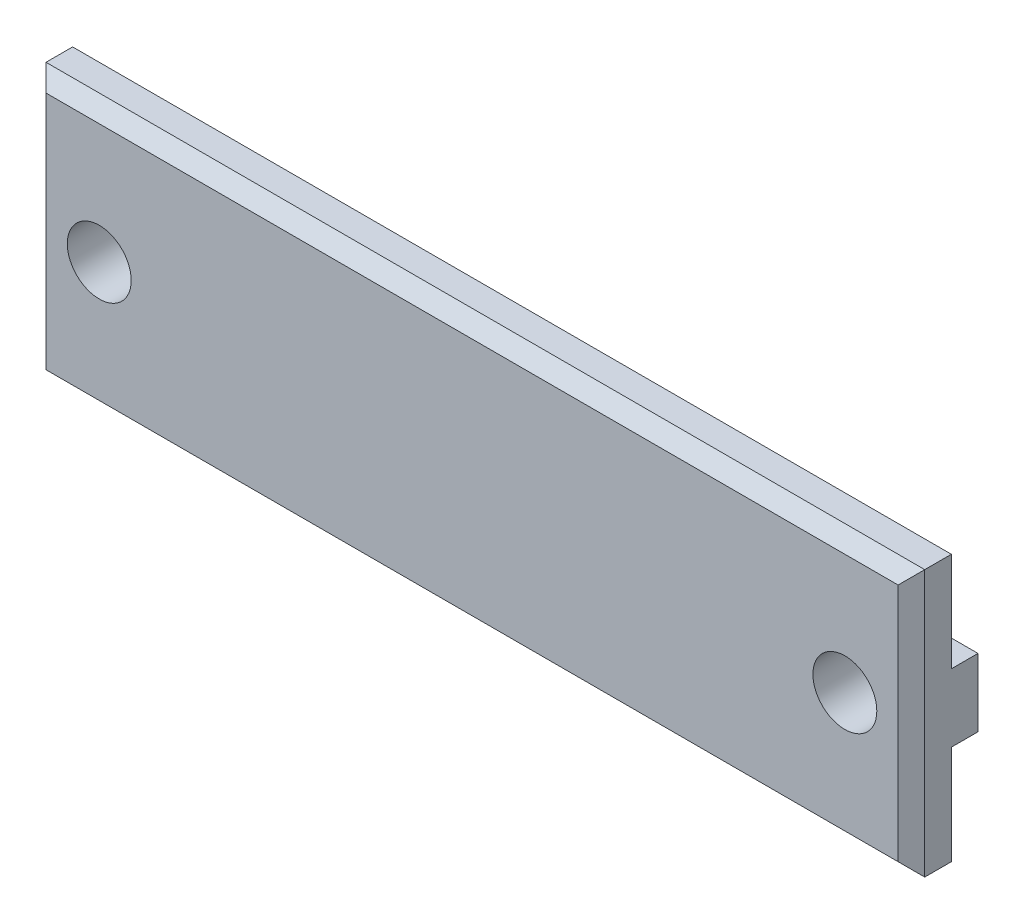
ISO-10303-21;
HEADER;
FILE_DESCRIPTION(('STEP AP214'),'2;1');
FILE_NAME('part.step','',(''),(''),'','','');
FILE_SCHEMA(('AUTOMOTIVE_DESIGN { 1 0 10303 214 1 1 1 1 }'));
ENDSEC;
DATA;
#1=APPLICATION_CONTEXT('core data for automotive mechanical design processes');
#2=APPLICATION_PROTOCOL_DEFINITION('international standard','automotive_design',2000,#1);
#3=PRODUCT_CONTEXT('',#1,'mechanical');
#4=PRODUCT('Part','Part','',(#3));
#5=PRODUCT_RELATED_PRODUCT_CATEGORY('part','',(#4));
#6=PRODUCT_DEFINITION_FORMATION('','',#4);
#7=PRODUCT_DEFINITION_CONTEXT('part definition',#1,'design');
#8=PRODUCT_DEFINITION('design','',#6,#7);
#9=PRODUCT_DEFINITION_SHAPE('','',#8);
#10=(LENGTH_UNIT() NAMED_UNIT(*) SI_UNIT(.MILLI.,.METRE.));
#11=(NAMED_UNIT(*) PLANE_ANGLE_UNIT() SI_UNIT($,.RADIAN.));
#12=(NAMED_UNIT(*) SI_UNIT($,.STERADIAN.) SOLID_ANGLE_UNIT());
#13=UNCERTAINTY_MEASURE_WITH_UNIT(LENGTH_MEASURE(1.E-05),#10,'distance_accuracy_value','');
#14=(GEOMETRIC_REPRESENTATION_CONTEXT(3) GLOBAL_UNCERTAINTY_ASSIGNED_CONTEXT((#13)) GLOBAL_UNIT_ASSIGNED_CONTEXT((#10,
#11,#12)) REPRESENTATION_CONTEXT('',''));
#15=CARTESIAN_POINT('',(0.,0.,0.));
#16=DIRECTION('',(0.,0.,1.));
#17=DIRECTION('',(1.,0.,0.));
#18=AXIS2_PLACEMENT_3D('',#15,#16,#17);
#19=CARTESIAN_POINT('',(0.,0.,2.));
#20=DIRECTION('',(0.,0.,1.));
#21=DIRECTION('',(1.,0.,0.));
#22=AXIS2_PLACEMENT_3D('',#19,#20,#21);
#23=PLANE('',#22);
#24=DIRECTION('',(-1.,0.,0.));
#25=VECTOR('',#24,1.);
#26=CARTESIAN_POINT('',(23.,2.55,2.));
#27=LINE('',#26,#25);
#28=CARTESIAN_POINT('',(33.,2.55,2.));
#29=VERTEX_POINT('',#28);
#30=CARTESIAN_POINT('',(23.,2.55,2.));
#31=VERTEX_POINT('',#30);
#32=EDGE_CURVE('E161',#29,#31,#27,.T.);
#33=ORIENTED_EDGE('',*,*,#32,.T.);
#34=DIRECTION('',(0.,-1.,0.));
#35=VECTOR('',#34,1.);
#36=CARTESIAN_POINT('',(23.,2.55,2.));
#37=LINE('',#36,#35);
#38=CARTESIAN_POINT('',(23.,-2.55,2.));
#39=VERTEX_POINT('',#38);
#40=EDGE_CURVE('E188',#31,#39,#37,.T.);
#41=ORIENTED_EDGE('',*,*,#40,.T.);
#42=DIRECTION('',(1.,0.,0.));
#43=VECTOR('',#42,1.);
#44=CARTESIAN_POINT('',(23.,-2.55,2.));
#45=LINE('',#44,#43);
#46=CARTESIAN_POINT('',(33.,-2.55,2.));
#47=VERTEX_POINT('',#46);
#48=EDGE_CURVE('E170',#39,#47,#45,.T.);
#49=ORIENTED_EDGE('',*,*,#48,.T.);
#50=DIRECTION('',(0.,1.,0.));
#51=VECTOR('',#50,1.);
#52=CARTESIAN_POINT('',(33.,10.,2.));
#53=LINE('',#52,#51);
#54=CARTESIAN_POINT('',(33.,-10.,2.));
#55=VERTEX_POINT('',#54);
#56=EDGE_CURVE('E168',#55,#47,#53,.T.);
#57=ORIENTED_EDGE('',*,*,#56,.F.);
#58=DIRECTION('',(1.,0.,0.));
#59=VECTOR('',#58,1.);
#60=CARTESIAN_POINT('',(-33.,-10.,2.));
#61=LINE('',#60,#59);
#62=CARTESIAN_POINT('',(-33.,-10.,2.));
#63=VERTEX_POINT('',#62);
#64=EDGE_CURVE('E197',#63,#55,#61,.T.);
#65=ORIENTED_EDGE('',*,*,#64,.F.);
#66=DIRECTION('',(0.,-1.,0.));
#67=VECTOR('',#66,1.);
#68=CARTESIAN_POINT('',(-33.,10.,2.));
#69=LINE('',#68,#67);
#70=CARTESIAN_POINT('',(-33.,-2.55,2.));
#71=VERTEX_POINT('',#70);
#72=EDGE_CURVE('E176',#71,#63,#69,.T.);
#73=ORIENTED_EDGE('',*,*,#72,.F.);
#74=DIRECTION('',(1.,0.,0.));
#75=VECTOR('',#74,1.);
#76=CARTESIAN_POINT('',(-33.,-2.55,2.));
#77=LINE('',#76,#75);
#78=CARTESIAN_POINT('',(-23.,-2.55,2.));
#79=VERTEX_POINT('',#78);
#80=EDGE_CURVE('E230',#71,#79,#77,.T.);
#81=ORIENTED_EDGE('',*,*,#80,.T.);
#82=DIRECTION('',(0.,1.,0.));
#83=VECTOR('',#82,1.);
#84=CARTESIAN_POINT('',(-23.,2.55,2.));
#85=LINE('',#84,#83);
#86=CARTESIAN_POINT('',(-23.,2.55,2.));
#87=VERTEX_POINT('',#86);
#88=EDGE_CURVE('E221',#79,#87,#85,.T.);
#89=ORIENTED_EDGE('',*,*,#88,.T.);
#90=DIRECTION('',(-1.,0.,0.));
#91=VECTOR('',#90,1.);
#92=CARTESIAN_POINT('',(-33.,2.55,2.));
#93=LINE('',#92,#91);
#94=CARTESIAN_POINT('',(-33.,2.55,2.));
#95=VERTEX_POINT('',#94);
#96=EDGE_CURVE('E225',#87,#95,#93,.T.);
#97=ORIENTED_EDGE('',*,*,#96,.T.);
#98=CARTESIAN_POINT('',(-33.,10.,2.));
#99=VERTEX_POINT('',#98);
#100=EDGE_CURVE('E181',#99,#95,#69,.T.);
#101=ORIENTED_EDGE('',*,*,#100,.F.);
#102=DIRECTION('',(-1.,0.,0.));
#103=VECTOR('',#102,1.);
#104=CARTESIAN_POINT('',(-33.,10.,2.));
#105=LINE('',#104,#103);
#106=CARTESIAN_POINT('',(33.,10.,2.));
#107=VERTEX_POINT('',#106);
#108=EDGE_CURVE('E204',#107,#99,#105,.T.);
#109=ORIENTED_EDGE('',*,*,#108,.F.);
#110=EDGE_CURVE('E201',#29,#107,#53,.T.);
#111=ORIENTED_EDGE('',*,*,#110,.F.);
#112=EDGE_LOOP('',(#33,#41,#49,#57,#65,#73,#81,#89,#97,#101,#109,#111));
#113=FACE_BOUND('',#112,.T.);
#114=ADVANCED_FACE('F45',(#113),#23,.F.);
#115=CARTESIAN_POINT('',(-23.,2.55,2.));
#116=DIRECTION('',(-1.,0.,0.));
#117=DIRECTION('',(0.,0.,1.));
#118=AXIS2_PLACEMENT_3D('',#115,#116,#117);
#119=PLANE('',#118);
#120=DIRECTION('',(0.,1.,0.));
#121=VECTOR('',#120,1.);
#122=CARTESIAN_POINT('',(-23.,2.55,0.));
#123=LINE('',#122,#121);
#124=CARTESIAN_POINT('',(-23.,-2.55,0.));
#125=VERTEX_POINT('',#124);
#126=CARTESIAN_POINT('',(-23.,2.55,0.));
#127=VERTEX_POINT('',#126);
#128=EDGE_CURVE('E220',#125,#127,#123,.T.);
#129=ORIENTED_EDGE('',*,*,#128,.T.);
#130=DIRECTION('',(0.,0.,-1.));
#131=VECTOR('',#130,1.);
#132=CARTESIAN_POINT('',(-23.,2.55,2.));
#133=LINE('',#132,#131);
#134=EDGE_CURVE('E257',#87,#127,#133,.T.);
#135=ORIENTED_EDGE('',*,*,#134,.F.);
#136=ORIENTED_EDGE('',*,*,#88,.F.);
#137=DIRECTION('',(0.,0.,-1.));
#138=VECTOR('',#137,1.);
#139=CARTESIAN_POINT('',(-23.,-2.55,2.));
#140=LINE('',#139,#138);
#141=EDGE_CURVE('E234',#79,#125,#140,.T.);
#142=ORIENTED_EDGE('',*,*,#141,.T.);
#143=EDGE_LOOP('',(#129,#135,#136,#142));
#144=FACE_BOUND('',#143,.T.);
#145=ADVANCED_FACE('F364',(#144),#119,.F.);
#146=CARTESIAN_POINT('',(-33.,2.55,2.));
#147=DIRECTION('',(0.,-1.,0.));
#148=DIRECTION('',(0.,0.,-1.));
#149=AXIS2_PLACEMENT_3D('',#146,#147,#148);
#150=PLANE('',#149);
#151=DIRECTION('',(-1.,0.,0.));
#152=VECTOR('',#151,1.);
#153=CARTESIAN_POINT('',(-33.,2.55,0.));
#154=LINE('',#153,#152);
#155=CARTESIAN_POINT('',(-33.,2.55,0.));
#156=VERTEX_POINT('',#155);
#157=EDGE_CURVE('E238',#127,#156,#154,.T.);
#158=ORIENTED_EDGE('',*,*,#157,.T.);
#159=DIRECTION('',(0.,0.,-1.));
#160=VECTOR('',#159,1.);
#161=CARTESIAN_POINT('',(-33.,2.55,2.));
#162=LINE('',#161,#160);
#163=EDGE_CURVE('E253',#95,#156,#162,.T.);
#164=ORIENTED_EDGE('',*,*,#163,.F.);
#165=ORIENTED_EDGE('',*,*,#96,.F.);
#166=ORIENTED_EDGE('',*,*,#134,.T.);
#167=EDGE_LOOP('',(#158,#164,#165,#166));
#168=FACE_BOUND('',#167,.T.);
#169=ADVANCED_FACE('F369',(#168),#150,.F.);
#170=CARTESIAN_POINT('',(-33.,2.55,2.));
#171=DIRECTION('',(1.,0.,0.));
#172=DIRECTION('',(0.,0.,-1.));
#173=AXIS2_PLACEMENT_3D('',#170,#171,#172);
#174=PLANE('',#173);
#175=DIRECTION('',(0.,0.,-1.));
#176=VECTOR('',#175,1.);
#177=CARTESIAN_POINT('',(-33.,-10.,5.));
#178=LINE('',#177,#176);
#179=CARTESIAN_POINT('',(-33.,-10.,4.));
#180=VERTEX_POINT('',#179);
#181=EDGE_CURVE('E217',#180,#63,#178,.T.);
#182=ORIENTED_EDGE('',*,*,#181,.F.);
#183=DIRECTION('',(0.,1.,0.));
#184=VECTOR('',#183,1.);
#185=CARTESIAN_POINT('',(-33.,10.,4.));
#186=LINE('',#185,#184);
#187=CARTESIAN_POINT('',(-33.,10.,4.));
#188=VERTEX_POINT('',#187);
#189=EDGE_CURVE('E11',#180,#188,#186,.T.);
#190=ORIENTED_EDGE('',*,*,#189,.T.);
#191=DIRECTION('',(0.,0.,-1.));
#192=VECTOR('',#191,1.);
#193=CARTESIAN_POINT('',(-33.,10.,5.));
#194=LINE('',#193,#192);
#195=EDGE_CURVE('E208',#188,#99,#194,.T.);
#196=ORIENTED_EDGE('',*,*,#195,.T.);
#197=ORIENTED_EDGE('',*,*,#100,.T.);
#198=ORIENTED_EDGE('',*,*,#163,.T.);
#199=DIRECTION('',(0.,-1.,0.));
#200=VECTOR('',#199,1.);
#201=CARTESIAN_POINT('',(-33.,2.55,0.));
#202=LINE('',#201,#200);
#203=CARTESIAN_POINT('',(-33.,-2.55,0.));
#204=VERTEX_POINT('',#203);
#205=EDGE_CURVE('E241',#156,#204,#202,.T.);
#206=ORIENTED_EDGE('',*,*,#205,.T.);
#207=DIRECTION('',(0.,0.,-1.));
#208=VECTOR('',#207,1.);
#209=CARTESIAN_POINT('',(-33.,-2.55,2.));
#210=LINE('',#209,#208);
#211=EDGE_CURVE('E249',#71,#204,#210,.T.);
#212=ORIENTED_EDGE('',*,*,#211,.F.);
#213=ORIENTED_EDGE('',*,*,#72,.T.);
#214=EDGE_LOOP('',(#182,#190,#196,#197,#198,#206,#212,#213));
#215=FACE_BOUND('',#214,.T.);
#216=ADVANCED_FACE('F389',(#215),#174,.F.);
#217=CARTESIAN_POINT('',(-33.,-2.55,2.));
#218=DIRECTION('',(0.,1.,0.));
#219=DIRECTION('',(0.,0.,1.));
#220=AXIS2_PLACEMENT_3D('',#217,#218,#219);
#221=PLANE('',#220);
#222=DIRECTION('',(1.,0.,0.));
#223=VECTOR('',#222,1.);
#224=CARTESIAN_POINT('',(-33.,-2.55,0.));
#225=LINE('',#224,#223);
#226=EDGE_CURVE('E226',#204,#125,#225,.T.);
#227=ORIENTED_EDGE('',*,*,#226,.T.);
#228=ORIENTED_EDGE('',*,*,#141,.F.);
#229=ORIENTED_EDGE('',*,*,#80,.F.);
#230=ORIENTED_EDGE('',*,*,#211,.T.);
#231=EDGE_LOOP('',(#227,#228,#229,#230));
#232=FACE_BOUND('',#231,.T.);
#233=ADVANCED_FACE('F385',(#232),#221,.F.);
#234=CARTESIAN_POINT('',(0.,0.,0.));
#235=DIRECTION('',(0.,0.,1.));
#236=DIRECTION('',(1.,0.,0.));
#237=AXIS2_PLACEMENT_3D('',#234,#235,#236);
#238=PLANE('',#237);
#239=CARTESIAN_POINT('',(-28.,0.,0.));
#240=DIRECTION('',(0.,0.,1.));
#241=DIRECTION('',(1.,0.,0.));
#242=AXIS2_PLACEMENT_3D('',#239,#240,#241);
#243=CIRCLE('',#242,2.4);
#244=CARTESIAN_POINT('',(-25.6,0.,0.));
#245=VERTEX_POINT('',#244);
#246=EDGE_CURVE('E302',#245,#245,#243,.T.);
#247=ORIENTED_EDGE('',*,*,#246,.T.);
#248=EDGE_LOOP('',(#247));
#249=FACE_BOUND('',#248,.T.);
#250=ORIENTED_EDGE('',*,*,#128,.F.);
#251=ORIENTED_EDGE('',*,*,#226,.F.);
#252=ORIENTED_EDGE('',*,*,#205,.F.);
#253=ORIENTED_EDGE('',*,*,#157,.F.);
#254=EDGE_LOOP('',(#250,#251,#252,#253));
#255=FACE_BOUND('',#254,.T.);
#256=ADVANCED_FACE('F382',(#249,#255),#238,.F.);
#257=CARTESIAN_POINT('',(-33.,-10.,5.));
#258=DIRECTION('',(0.,1.,0.));
#259=DIRECTION('',(0.,0.,1.));
#260=AXIS2_PLACEMENT_3D('',#257,#258,#259);
#261=PLANE('',#260);
#262=DIRECTION('',(0.,0.,-1.));
#263=VECTOR('',#262,1.);
#264=CARTESIAN_POINT('',(33.,-10.,5.));
#265=LINE('',#264,#263);
#266=CARTESIAN_POINT('',(33.,-10.,4.));
#267=VERTEX_POINT('',#266);
#268=EDGE_CURVE('E214',#267,#55,#265,.T.);
#269=ORIENTED_EDGE('',*,*,#268,.F.);
#270=DIRECTION('',(-1.,0.,0.));
#271=VECTOR('',#270,1.);
#272=CARTESIAN_POINT('',(-33.,-10.,4.));
#273=LINE('',#272,#271);
#274=EDGE_CURVE('E56',#267,#180,#273,.T.);
#275=ORIENTED_EDGE('',*,*,#274,.T.);
#276=ORIENTED_EDGE('',*,*,#181,.T.);
#277=ORIENTED_EDGE('',*,*,#64,.T.);
#278=EDGE_LOOP('',(#269,#275,#276,#277));
#279=FACE_BOUND('',#278,.T.);
#280=ADVANCED_FACE('F379',(#279),#261,.F.);
#281=CARTESIAN_POINT('',(33.,10.,5.));
#282=DIRECTION('',(-1.,0.,0.));
#283=DIRECTION('',(0.,0.,1.));
#284=AXIS2_PLACEMENT_3D('',#281,#282,#283);
#285=PLANE('',#284);
#286=DIRECTION('',(0.,0.,-1.));
#287=VECTOR('',#286,1.);
#288=CARTESIAN_POINT('',(33.,10.,5.));
#289=LINE('',#288,#287);
#290=CARTESIAN_POINT('',(33.,10.,4.));
#291=VERTEX_POINT('',#290);
#292=EDGE_CURVE('E211',#291,#107,#289,.T.);
#293=ORIENTED_EDGE('',*,*,#292,.F.);
#294=DIRECTION('',(0.,-1.,0.));
#295=VECTOR('',#294,1.);
#296=CARTESIAN_POINT('',(33.,-10.,4.));
#297=LINE('',#296,#295);
#298=EDGE_CURVE('E71',#291,#267,#297,.T.);
#299=ORIENTED_EDGE('',*,*,#298,.T.);
#300=ORIENTED_EDGE('',*,*,#268,.T.);
#301=ORIENTED_EDGE('',*,*,#56,.T.);
#302=DIRECTION('',(0.,0.,-1.));
#303=VECTOR('',#302,1.);
#304=CARTESIAN_POINT('',(33.,-2.55,2.));
#305=LINE('',#304,#303);
#306=CARTESIAN_POINT('',(33.,-2.55,0.));
#307=VERTEX_POINT('',#306);
#308=EDGE_CURVE('E153',#47,#307,#305,.T.);
#309=ORIENTED_EDGE('',*,*,#308,.T.);
#310=DIRECTION('',(0.,1.,0.));
#311=VECTOR('',#310,1.);
#312=CARTESIAN_POINT('',(33.,2.55,0.));
#313=LINE('',#312,#311);
#314=CARTESIAN_POINT('',(33.,2.55,0.));
#315=VERTEX_POINT('',#314);
#316=EDGE_CURVE('E166',#307,#315,#313,.T.);
#317=ORIENTED_EDGE('',*,*,#316,.T.);
#318=DIRECTION('',(0.,0.,-1.));
#319=VECTOR('',#318,1.);
#320=CARTESIAN_POINT('',(33.,2.55,2.));
#321=LINE('',#320,#319);
#322=EDGE_CURVE('E318',#29,#315,#321,.T.);
#323=ORIENTED_EDGE('',*,*,#322,.F.);
#324=ORIENTED_EDGE('',*,*,#110,.T.);
#325=EDGE_LOOP('',(#293,#299,#300,#301,#309,#317,#323,#324));
#326=FACE_BOUND('',#325,.T.);
#327=ADVANCED_FACE('F165',(#326),#285,.F.);
#328=CARTESIAN_POINT('',(-33.,10.,5.));
#329=DIRECTION('',(0.,-1.,0.));
#330=DIRECTION('',(0.,0.,-1.));
#331=AXIS2_PLACEMENT_3D('',#328,#329,#330);
#332=PLANE('',#331);
#333=ORIENTED_EDGE('',*,*,#195,.F.);
#334=DIRECTION('',(1.,0.,0.));
#335=VECTOR('',#334,1.);
#336=CARTESIAN_POINT('',(33.,10.,4.));
#337=LINE('',#336,#335);
#338=EDGE_CURVE('E274',#188,#291,#337,.T.);
#339=ORIENTED_EDGE('',*,*,#338,.T.);
#340=ORIENTED_EDGE('',*,*,#292,.T.);
#341=ORIENTED_EDGE('',*,*,#108,.T.);
#342=EDGE_LOOP('',(#333,#339,#340,#341));
#343=FACE_BOUND('',#342,.T.);
#344=ADVANCED_FACE('F341',(#343),#332,.F.);
#345=CARTESIAN_POINT('',(0.,0.,5.));
#346=DIRECTION('',(0.,0.,1.));
#347=DIRECTION('',(1.,0.,0.));
#348=AXIS2_PLACEMENT_3D('',#345,#346,#347);
#349=PLANE('',#348);
#350=DIRECTION('',(0.,1.,0.));
#351=VECTOR('',#350,1.);
#352=CARTESIAN_POINT('',(32.,10.,5.));
#353=LINE('',#352,#351);
#354=CARTESIAN_POINT('',(32.,-9.00000000000001,5.));
#355=VERTEX_POINT('',#354);
#356=CARTESIAN_POINT('',(32.,9.00000000000001,5.));
#357=VERTEX_POINT('',#356);
#358=EDGE_CURVE('E267',#355,#357,#353,.T.);
#359=ORIENTED_EDGE('',*,*,#358,.T.);
#360=DIRECTION('',(-1.,0.,0.));
#361=VECTOR('',#360,1.);
#362=CARTESIAN_POINT('',(-33.,9.00000000000001,5.));
#363=LINE('',#362,#361);
#364=CARTESIAN_POINT('',(-32.,9.00000000000001,5.));
#365=VERTEX_POINT('',#364);
#366=EDGE_CURVE('E270',#357,#365,#363,.T.);
#367=ORIENTED_EDGE('',*,*,#366,.T.);
#368=DIRECTION('',(0.,-1.,0.));
#369=VECTOR('',#368,1.);
#370=CARTESIAN_POINT('',(-32.,-10.,5.));
#371=LINE('',#370,#369);
#372=CARTESIAN_POINT('',(-32.,-9.00000000000001,5.));
#373=VERTEX_POINT('',#372);
#374=EDGE_CURVE('E261',#365,#373,#371,.T.);
#375=ORIENTED_EDGE('',*,*,#374,.T.);
#376=DIRECTION('',(1.,0.,0.));
#377=VECTOR('',#376,1.);
#378=CARTESIAN_POINT('',(33.,-9.00000000000001,5.));
#379=LINE('',#378,#377);
#380=EDGE_CURVE('E264',#373,#355,#379,.T.);
#381=ORIENTED_EDGE('',*,*,#380,.T.);
#382=EDGE_LOOP('',(#359,#367,#375,#381));
#383=FACE_BOUND('',#382,.T.);
#384=CARTESIAN_POINT('',(-28.,0.,5.));
#385=DIRECTION('',(0.,0.,1.));
#386=DIRECTION('',(1.,0.,0.));
#387=AXIS2_PLACEMENT_3D('',#384,#385,#386);
#388=CIRCLE('',#387,2.39999999999999);
#389=CARTESIAN_POINT('',(-25.6,0.,5.));
#390=VERTEX_POINT('',#389);
#391=EDGE_CURVE('E296',#390,#390,#388,.T.);
#392=ORIENTED_EDGE('',*,*,#391,.F.);
#393=EDGE_LOOP('',(#392));
#394=FACE_BOUND('',#393,.T.);
#395=CARTESIAN_POINT('',(28.,0.,5.));
#396=DIRECTION('',(0.,0.,1.));
#397=DIRECTION('',(1.,0.,0.));
#398=AXIS2_PLACEMENT_3D('',#395,#396,#397);
#399=CIRCLE('',#398,2.39999999999999);
#400=CARTESIAN_POINT('',(30.4,0.,5.));
#401=VERTEX_POINT('',#400);
#402=EDGE_CURVE('E308',#401,#401,#399,.T.);
#403=ORIENTED_EDGE('',*,*,#402,.F.);
#404=EDGE_LOOP('',(#403));
#405=FACE_BOUND('',#404,.T.);
#406=ADVANCED_FACE('F351',(#383,#394,#405),#349,.T.);
#407=CARTESIAN_POINT('',(23.,2.55,2.));
#408=DIRECTION('',(0.,-1.,0.));
#409=DIRECTION('',(0.,0.,-1.));
#410=AXIS2_PLACEMENT_3D('',#407,#408,#409);
#411=PLANE('',#410);
#412=DIRECTION('',(-1.,0.,0.));
#413=VECTOR('',#412,1.);
#414=CARTESIAN_POINT('',(23.,2.55,0.));
#415=LINE('',#414,#413);
#416=CARTESIAN_POINT('',(23.,2.55,0.));
#417=VERTEX_POINT('',#416);
#418=EDGE_CURVE('E173',#315,#417,#415,.T.);
#419=ORIENTED_EDGE('',*,*,#418,.T.);
#420=DIRECTION('',(0.,0.,-1.));
#421=VECTOR('',#420,1.);
#422=CARTESIAN_POINT('',(23.,2.55,2.));
#423=LINE('',#422,#421);
#424=EDGE_CURVE('E321',#31,#417,#423,.T.);
#425=ORIENTED_EDGE('',*,*,#424,.F.);
#426=ORIENTED_EDGE('',*,*,#32,.F.);
#427=ORIENTED_EDGE('',*,*,#322,.T.);
#428=EDGE_LOOP('',(#419,#425,#426,#427));
#429=FACE_BOUND('',#428,.T.);
#430=ADVANCED_FACE('F332',(#429),#411,.F.);
#431=CARTESIAN_POINT('',(23.,2.55,2.));
#432=DIRECTION('',(1.,0.,0.));
#433=DIRECTION('',(0.,0.,-1.));
#434=AXIS2_PLACEMENT_3D('',#431,#432,#433);
#435=PLANE('',#434);
#436=DIRECTION('',(0.,-1.,0.));
#437=VECTOR('',#436,1.);
#438=CARTESIAN_POINT('',(23.,2.55,0.));
#439=LINE('',#438,#437);
#440=CARTESIAN_POINT('',(23.,-2.55,0.));
#441=VERTEX_POINT('',#440);
#442=EDGE_CURVE('E160',#417,#441,#439,.T.);
#443=ORIENTED_EDGE('',*,*,#442,.T.);
#444=DIRECTION('',(0.,0.,-1.));
#445=VECTOR('',#444,1.);
#446=CARTESIAN_POINT('',(23.,-2.55,2.));
#447=LINE('',#446,#445);
#448=EDGE_CURVE('E155',#39,#441,#447,.T.);
#449=ORIENTED_EDGE('',*,*,#448,.F.);
#450=ORIENTED_EDGE('',*,*,#40,.F.);
#451=ORIENTED_EDGE('',*,*,#424,.T.);
#452=EDGE_LOOP('',(#443,#449,#450,#451));
#453=FACE_BOUND('',#452,.T.);
#454=ADVANCED_FACE('F328',(#453),#435,.F.);
#455=CARTESIAN_POINT('',(23.,-2.55,2.));
#456=DIRECTION('',(0.,1.,0.));
#457=DIRECTION('',(0.,0.,1.));
#458=AXIS2_PLACEMENT_3D('',#455,#456,#457);
#459=PLANE('',#458);
#460=DIRECTION('',(1.,0.,0.));
#461=VECTOR('',#460,1.);
#462=CARTESIAN_POINT('',(23.,-2.55,0.));
#463=LINE('',#462,#461);
#464=EDGE_CURVE('E149',#441,#307,#463,.T.);
#465=ORIENTED_EDGE('',*,*,#464,.T.);
#466=ORIENTED_EDGE('',*,*,#308,.F.);
#467=ORIENTED_EDGE('',*,*,#48,.F.);
#468=ORIENTED_EDGE('',*,*,#448,.T.);
#469=EDGE_LOOP('',(#465,#466,#467,#468));
#470=FACE_BOUND('',#469,.T.);
#471=ADVANCED_FACE('F151',(#470),#459,.F.);
#472=CARTESIAN_POINT('',(0.,0.,0.));
#473=DIRECTION('',(0.,0.,1.));
#474=DIRECTION('',(1.,0.,0.));
#475=AXIS2_PLACEMENT_3D('',#472,#473,#474);
#476=PLANE('',#475);
#477=CARTESIAN_POINT('',(28.,0.,0.));
#478=DIRECTION('',(0.,0.,1.));
#479=DIRECTION('',(1.,0.,0.));
#480=AXIS2_PLACEMENT_3D('',#477,#478,#479);
#481=CIRCLE('',#480,2.4);
#482=CARTESIAN_POINT('',(30.4,0.,0.));
#483=VERTEX_POINT('',#482);
#484=EDGE_CURVE('E314',#483,#483,#481,.T.);
#485=ORIENTED_EDGE('',*,*,#484,.T.);
#486=EDGE_LOOP('',(#485));
#487=FACE_BOUND('',#486,.T.);
#488=ORIENTED_EDGE('',*,*,#316,.F.);
#489=ORIENTED_EDGE('',*,*,#464,.F.);
#490=ORIENTED_EDGE('',*,*,#442,.F.);
#491=ORIENTED_EDGE('',*,*,#418,.F.);
#492=EDGE_LOOP('',(#488,#489,#490,#491));
#493=FACE_BOUND('',#492,.T.);
#494=ADVANCED_FACE('F172',(#487,#493),#476,.F.);
#495=CARTESIAN_POINT('',(28.,0.,5.));
#496=DIRECTION('',(0.,0.,1.));
#497=DIRECTION('',(1.,0.,0.));
#498=AXIS2_PLACEMENT_3D('',#495,#496,#497);
#499=CYLINDRICAL_SURFACE('',#498,2.39999999999999);
#500=ORIENTED_EDGE('',*,*,#484,.F.);
#501=EDGE_LOOP('',(#500));
#502=FACE_BOUND('',#501,.T.);
#503=ORIENTED_EDGE('',*,*,#402,.T.);
#504=EDGE_LOOP('',(#503));
#505=FACE_BOUND('',#504,.T.);
#506=ADVANCED_FACE('F475',(#502,#505),#499,.F.);
#507=CARTESIAN_POINT('',(-28.,0.,5.));
#508=DIRECTION('',(0.,0.,1.));
#509=DIRECTION('',(1.,0.,0.));
#510=AXIS2_PLACEMENT_3D('',#507,#508,#509);
#511=CYLINDRICAL_SURFACE('',#510,2.39999999999999);
#512=ORIENTED_EDGE('',*,*,#246,.F.);
#513=EDGE_LOOP('',(#512));
#514=FACE_BOUND('',#513,.T.);
#515=ORIENTED_EDGE('',*,*,#391,.T.);
#516=EDGE_LOOP('',(#515));
#517=FACE_BOUND('',#516,.T.);
#518=ADVANCED_FACE('F360',(#514,#517),#511,.F.);
#519=CARTESIAN_POINT('',(0.,-9.00000000000001,5.));
#520=DIRECTION('',(0.,-0.707106781186552,0.707106781186543));
#521=DIRECTION('',(-1.,0.,0.));
#522=AXIS2_PLACEMENT_3D('',#519,#520,#521);
#523=PLANE('',#522);
#524=DIRECTION('',(0.577350269189623,0.577350269189623,0.577350269189631));
#525=VECTOR('',#524,1.);
#526=CARTESIAN_POINT('',(-29.,-6.00000000000004,8.00000000000002));
#527=LINE('',#526,#525);
#528=EDGE_CURVE('E287',#180,#373,#527,.T.);
#529=ORIENTED_EDGE('',*,*,#528,.F.);
#530=ORIENTED_EDGE('',*,*,#274,.F.);
#531=DIRECTION('',(-0.577350269189623,0.577350269189623,0.577350269189631));
#532=VECTOR('',#531,1.);
#533=CARTESIAN_POINT('',(21.3333333333334,1.66666666666656,15.6666666666667));
#534=LINE('',#533,#532);
#535=EDGE_CURVE('E50',#355,#267,#534,.F.);
#536=ORIENTED_EDGE('',*,*,#535,.F.);
#537=ORIENTED_EDGE('',*,*,#380,.F.);
#538=EDGE_LOOP('',(#529,#530,#536,#537));
#539=FACE_BOUND('',#538,.T.);
#540=ADVANCED_FACE('F48',(#539),#523,.T.);
#541=CARTESIAN_POINT('',(32.,0.,5.));
#542=DIRECTION('',(0.707106781186552,0.,0.707106781186543));
#543=DIRECTION('',(0.,-1.,0.));
#544=AXIS2_PLACEMENT_3D('',#541,#542,#543);
#545=PLANE('',#544);
#546=ORIENTED_EDGE('',*,*,#535,.T.);
#547=ORIENTED_EDGE('',*,*,#298,.F.);
#548=DIRECTION('',(-0.577350269189623,-0.577350269189623,0.577350269189631));
#549=VECTOR('',#548,1.);
#550=CARTESIAN_POINT('',(29.,6.00000000000004,8.00000000000002));
#551=LINE('',#550,#549);
#552=EDGE_CURVE('E285',#357,#291,#551,.F.);
#553=ORIENTED_EDGE('',*,*,#552,.F.);
#554=ORIENTED_EDGE('',*,*,#358,.F.);
#555=EDGE_LOOP('',(#546,#547,#553,#554));
#556=FACE_BOUND('',#555,.T.);
#557=ADVANCED_FACE('F353',(#556),#545,.T.);
#558=CARTESIAN_POINT('',(-32.,0.,5.));
#559=DIRECTION('',(-0.707106781186552,0.,0.707106781186543));
#560=DIRECTION('',(0.,1.,0.));
#561=AXIS2_PLACEMENT_3D('',#558,#559,#560);
#562=PLANE('',#561);
#563=ORIENTED_EDGE('',*,*,#528,.T.);
#564=ORIENTED_EDGE('',*,*,#374,.F.);
#565=DIRECTION('',(-0.577350269189623,0.577350269189623,-0.577350269189631));
#566=VECTOR('',#565,1.);
#567=CARTESIAN_POINT('',(-29.,6.00000000000004,8.00000000000002));
#568=LINE('',#567,#566);
#569=EDGE_CURVE('E282',#188,#365,#568,.F.);
#570=ORIENTED_EDGE('',*,*,#569,.F.);
#571=ORIENTED_EDGE('',*,*,#189,.F.);
#572=EDGE_LOOP('',(#563,#564,#570,#571));
#573=FACE_BOUND('',#572,.T.);
#574=ADVANCED_FACE('F348',(#573),#562,.T.);
#575=CARTESIAN_POINT('',(0.,9.00000000000001,5.));
#576=DIRECTION('',(0.,0.707106781186552,0.707106781186543));
#577=DIRECTION('',(1.,0.,0.));
#578=AXIS2_PLACEMENT_3D('',#575,#576,#577);
#579=PLANE('',#578);
#580=ORIENTED_EDGE('',*,*,#552,.T.);
#581=ORIENTED_EDGE('',*,*,#338,.F.);
#582=ORIENTED_EDGE('',*,*,#569,.T.);
#583=ORIENTED_EDGE('',*,*,#366,.F.);
#584=EDGE_LOOP('',(#580,#581,#582,#583));
#585=FACE_BOUND('',#584,.T.);
#586=ADVANCED_FACE('F345',(#585),#579,.T.);
#587=CLOSED_SHELL('',(#114,#145,#169,#216,#233,#256,#280,#327,#344,#406,#430,#454,#471,#494,
#506,#518,#540,#557,#574,#586));
#588=MANIFOLD_SOLID_BREP('B2',#587);
#589=ADVANCED_BREP_SHAPE_REPRESENTATION('',(#18,#588),#14);
#590=SHAPE_DEFINITION_REPRESENTATION(#9,#589);
ENDSEC;
END-ISO-10303-21;
